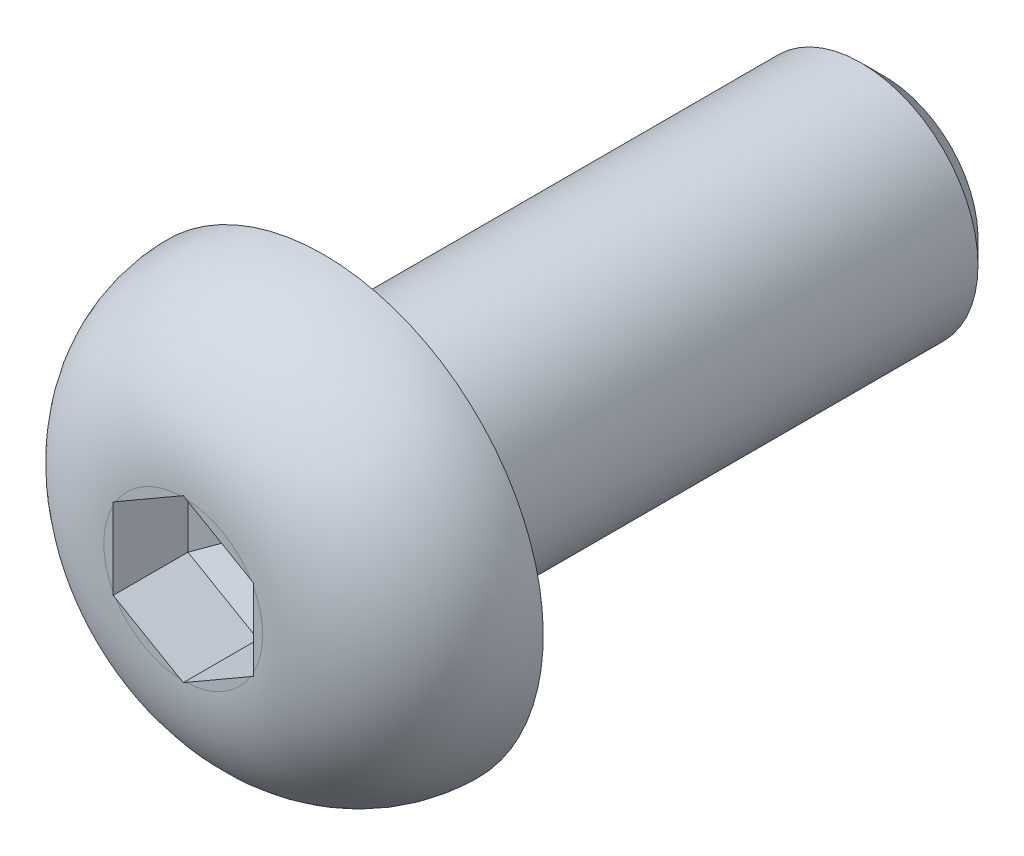
ISO-10303-21;
HEADER;
FILE_DESCRIPTION(('STEP AP214'),'2;1');
FILE_NAME('part.step','',(''),(''),'','','');
FILE_SCHEMA(('AUTOMOTIVE_DESIGN { 1 0 10303 214 1 1 1 1 }'));
ENDSEC;
DATA;
#1=APPLICATION_CONTEXT('core data for automotive mechanical design processes');
#2=APPLICATION_PROTOCOL_DEFINITION('international standard','automotive_design',2000,#1);
#3=PRODUCT_CONTEXT('',#1,'mechanical');
#4=PRODUCT('Part','Part','',(#3));
#5=PRODUCT_RELATED_PRODUCT_CATEGORY('part','',(#4));
#6=PRODUCT_DEFINITION_FORMATION('','',#4);
#7=PRODUCT_DEFINITION_CONTEXT('part definition',#1,'design');
#8=PRODUCT_DEFINITION('design','',#6,#7);
#9=PRODUCT_DEFINITION_SHAPE('','',#8);
#10=(LENGTH_UNIT() NAMED_UNIT(*) SI_UNIT(.MILLI.,.METRE.));
#11=(NAMED_UNIT(*) PLANE_ANGLE_UNIT() SI_UNIT($,.RADIAN.));
#12=(NAMED_UNIT(*) SI_UNIT($,.STERADIAN.) SOLID_ANGLE_UNIT());
#13=UNCERTAINTY_MEASURE_WITH_UNIT(LENGTH_MEASURE(1.E-05),#10,'distance_accuracy_value','');
#14=(GEOMETRIC_REPRESENTATION_CONTEXT(3) GLOBAL_UNCERTAINTY_ASSIGNED_CONTEXT((#13)) GLOBAL_UNIT_ASSIGNED_CONTEXT((#10,
#11,#12)) REPRESENTATION_CONTEXT('',''));
#15=CARTESIAN_POINT('',(0.,0.,0.));
#16=DIRECTION('',(0.,0.,1.));
#17=DIRECTION('',(1.,0.,0.));
#18=AXIS2_PLACEMENT_3D('',#15,#16,#17);
#19=CARTESIAN_POINT('',(0.,0.,7.5));
#20=DIRECTION('',(0.,0.,-1.));
#21=DIRECTION('',(0.,-1.,0.));
#22=AXIS2_PLACEMENT_3D('',#19,#20,#21);
#23=PLANE('',#22);
#24=CARTESIAN_POINT('',(0.,0.,7.499999999987));
#25=DIRECTION('',(0.,0.,-1.));
#26=DIRECTION('',(0.848717837075013,-0.528845944515708,0.));
#27=AXIS2_PLACEMENT_3D('',#24,#25,#26);
#28=CIRCLE('',#27,0.8499937568999);
#29=CARTESIAN_POINT('',(0.7214095809729,-0.4495192983039,7.5));
#30=VERTEX_POINT('',#29);
#31=CARTESIAN_POINT('',(0.02859309510343,-0.8495197335029,7.5));
#32=VERTEX_POINT('',#31);
#33=EDGE_CURVE('E224',#30,#32,#28,.T.);
#34=ORIENTED_EDGE('',*,*,#33,.F.);
#35=DIRECTION('',(0.86602396910502,0.500002484929412,6.10625033893714E-13));
#36=VECTOR('',#35,1.);
#37=CARTESIAN_POINT('',(0.02859309510343,-0.8495197335029,7.5));
#38=LINE('',#37,#36);
#39=EDGE_CURVE('E340',#32,#30,#38,.T.);
#40=ORIENTED_EDGE('',*,*,#39,.F.);
#41=EDGE_LOOP('',(#34,#40));
#42=FACE_BOUND('',#41,.T.);
#43=ADVANCED_FACE('F17',(#42),#23,.F.);
#44=CARTESIAN_POINT('',(0.,0.,7.5));
#45=DIRECTION('',(0.,0.,-1.));
#46=DIRECTION('',(0.,-1.,0.));
#47=AXIS2_PLACEMENT_3D('',#44,#45,#46);
#48=PLANE('',#47);
#49=CARTESIAN_POINT('',(0.,0.,7.499999999987));
#50=DIRECTION('',(0.,0.,-1.));
#51=DIRECTION('',(-0.0336351041015099,-0.999434179809797,0.));
#52=AXIS2_PLACEMENT_3D('',#49,#50,#51);
#53=CIRCLE('',#52,0.8499937568997);
#54=CARTESIAN_POINT('',(-0.02859309510341,-0.849519733503,7.499999999999));
#55=VERTEX_POINT('',#54);
#56=CARTESIAN_POINT('',(-0.7214095809727,-0.4495192983038,7.5));
#57=VERTEX_POINT('',#56);
#58=EDGE_CURVE('E210',#55,#57,#53,.T.);
#59=ORIENTED_EDGE('',*,*,#58,.F.);
#60=DIRECTION('',(0.866023969104909,-0.500002484929605,-6.31719353246506E-13));
#61=VECTOR('',#60,1.);
#62=CARTESIAN_POINT('',(-0.7214095809727,-0.4495192983038,7.5));
#63=LINE('',#62,#61);
#64=EDGE_CURVE('E316',#57,#55,#63,.T.);
#65=ORIENTED_EDGE('',*,*,#64,.F.);
#66=EDGE_LOOP('',(#59,#65));
#67=FACE_BOUND('',#66,.T.);
#68=ADVANCED_FACE('F406',(#67),#48,.F.);
#69=CARTESIAN_POINT('',(0.,0.,7.5));
#70=DIRECTION('',(0.,0.,-1.));
#71=DIRECTION('',(0.,-1.,0.));
#72=AXIS2_PLACEMENT_3D('',#69,#70,#71);
#73=PLANE('',#72);
#74=CARTESIAN_POINT('',(0.,0.,7.499999999987));
#75=DIRECTION('',(0.,0.,-1.));
#76=DIRECTION('',(-0.848717837075013,0.528845944515708,0.));
#77=AXIS2_PLACEMENT_3D('',#74,#75,#76);
#78=CIRCLE('',#77,0.8499937568999);
#79=CARTESIAN_POINT('',(-0.721409580973,0.4495192983038,7.5));
#80=VERTEX_POINT('',#79);
#81=CARTESIAN_POINT('',(-0.02859309510337,0.8495197335029,7.5));
#82=VERTEX_POINT('',#81);
#83=EDGE_CURVE('E208',#80,#82,#78,.T.);
#84=ORIENTED_EDGE('',*,*,#83,.F.);
#85=DIRECTION('',(-0.86602396910502,-0.500002484929412,6.10625033893614E-13));
#86=VECTOR('',#85,1.);
#87=CARTESIAN_POINT('',(-0.02859309510337,0.8495197335029,7.5));
#88=LINE('',#87,#86);
#89=EDGE_CURVE('E197',#82,#80,#88,.T.);
#90=ORIENTED_EDGE('',*,*,#89,.F.);
#91=EDGE_LOOP('',(#84,#90));
#92=FACE_BOUND('',#91,.T.);
#93=ADVANCED_FACE('F421',(#92),#73,.F.);
#94=CARTESIAN_POINT('',(0.,0.,7.5));
#95=DIRECTION('',(0.,0.,-1.));
#96=DIRECTION('',(0.,-1.,0.));
#97=AXIS2_PLACEMENT_3D('',#94,#95,#96);
#98=PLANE('',#97);
#99=CARTESIAN_POINT('',(0.,0.,7.499999999995));
#100=DIRECTION('',(0.,0.,-1.));
#101=DIRECTION('',(0.882352941176484,0.470588235294092,0.));
#102=AXIS2_PLACEMENT_3D('',#99,#100,#101);
#103=CIRCLE('',#102,0.8500038733679);
#104=CARTESIAN_POINT('',(0.74999840261235,0.400005026801156,7.49999999999049));
#105=VERTEX_POINT('',#104);
#106=CARTESIAN_POINT('',(0.749998738069626,-0.400003325957899,7.49999999999138));
#107=VERTEX_POINT('',#106);
#108=EDGE_CURVE('E360',#105,#107,#103,.T.);
#109=ORIENTED_EDGE('',*,*,#108,.F.);
#110=DIRECTION('',(0.,-1.,0.));
#111=VECTOR('',#110,1.);
#112=CARTESIAN_POINT('',(0.7499968052247,0.39999806325,7.499999999986));
#113=LINE('',#112,#111);
#114=EDGE_CURVE('E93',#105,#107,#113,.T.);
#115=ORIENTED_EDGE('',*,*,#114,.T.);
#116=EDGE_LOOP('',(#109,#115));
#117=FACE_BOUND('',#116,.T.);
#118=ADVANCED_FACE('F413',(#117),#98,.F.);
#119=CARTESIAN_POINT('',(0.,0.,7.5));
#120=DIRECTION('',(0.,0.,-1.));
#121=DIRECTION('',(0.,-1.,0.));
#122=AXIS2_PLACEMENT_3D('',#119,#120,#121);
#123=PLANE('',#122);
#124=CARTESIAN_POINT('',(0.,0.,7.499999999995));
#125=DIRECTION('',(0.,0.,-1.));
#126=DIRECTION('',(-0.882352941176484,-0.470588235294092,0.));
#127=AXIS2_PLACEMENT_3D('',#124,#125,#126);
#128=CIRCLE('',#127,0.8500038733679);
#129=CARTESIAN_POINT('',(-0.74999840261235,-0.400005026801156,7.49999999999049));
#130=VERTEX_POINT('',#129);
#131=CARTESIAN_POINT('',(-0.749998738069626,0.400003325957899,7.49999999999138));
#132=VERTEX_POINT('',#131);
#133=EDGE_CURVE('E385',#130,#132,#128,.T.);
#134=ORIENTED_EDGE('',*,*,#133,.F.);
#135=DIRECTION('',(0.,1.,0.));
#136=VECTOR('',#135,1.);
#137=CARTESIAN_POINT('',(-0.7499968052247,-0.39999806325,7.499999999986));
#138=LINE('',#137,#136);
#139=EDGE_CURVE('E11',#130,#132,#138,.T.);
#140=ORIENTED_EDGE('',*,*,#139,.T.);
#141=EDGE_LOOP('',(#134,#140));
#142=FACE_BOUND('',#141,.T.);
#143=ADVANCED_FACE('F411',(#142),#123,.F.);
#144=CARTESIAN_POINT('',(-0.75,0.4330127018922,7.5));
#145=DIRECTION('',(-1.,0.,0.));
#146=DIRECTION('',(0.,0.,1.));
#147=AXIS2_PLACEMENT_3D('',#144,#145,#146);
#148=PLANE('',#147);
#149=DIRECTION('',(2.24992903633302E-06,-5.67352059675705E-07,0.999999999997308));
#150=VECTOR('',#149,1.);
#151=CARTESIAN_POINT('',(-0.75,0.4330127018922,6.7));
#152=LINE('',#151,#150);
#153=CARTESIAN_POINT('',(-0.75,0.4330127018922,6.7));
#154=VERTEX_POINT('',#153);
#155=CARTESIAN_POINT('',(-0.749998523448235,0.43301280791993,7.49991440612962));
#156=VERTEX_POINT('',#155);
#157=EDGE_CURVE('E480',#154,#156,#152,.T.);
#158=ORIENTED_EDGE('',*,*,#157,.T.);
#159=CARTESIAN_POINT('',(-0.75,0.433012247970175,7.49991439546112));
#160=CARTESIAN_POINT('',(-0.75,0.42750992025355,7.49994336110495));
#161=CARTESIAN_POINT('',(-0.75,0.422007573480964,7.49996497763848));
#162=CARTESIAN_POINT('',(-0.75,0.411002842395928,7.49999351248346));
#163=CARTESIAN_POINT('',(-0.75,0.405500458083482,7.50000043079644));
#164=CARTESIAN_POINT('',(-0.75,0.39999805471508,7.50000000000065));
#165=B_SPLINE_CURVE_WITH_KNOTS('',3,(#159,#160,#161,#162,#163,#164),.UNSPECIFIED.,.F.,.F.,(4,2,
4),(0.,0.0165071677014205,0.0330143336866557),.UNSPECIFIED.);
#166=EDGE_CURVE('E303',#156,#132,#165,.T.);
#167=ORIENTED_EDGE('',*,*,#166,.T.);
#168=ORIENTED_EDGE('',*,*,#139,.F.);
#169=CARTESIAN_POINT('',(-0.75,-0.4000018227614,7.50000000000199));
#170=CARTESIAN_POINT('',(-0.75,-0.405503598118224,7.50000042758911));
#171=CARTESIAN_POINT('',(-0.75,-0.411005354421076,7.49999350767165));
#172=CARTESIAN_POINT('',(-0.75,-0.422008829490639,7.49996497282612));
#173=CARTESIAN_POINT('',(-0.75,-0.427510548257345,7.49994335789651));
#174=CARTESIAN_POINT('',(-0.75,-0.433012247970075,7.4999143954608));
#175=B_SPLINE_CURVE_WITH_KNOTS('',3,(#169,#170,#171,#172,#173,#174),.UNSPECIFIED.,.F.,.F.,(4,2,
4),(0.,0.0165052819639968,0.0330105656434137),.UNSPECIFIED.);
#176=CARTESIAN_POINT('',(-0.749999423323558,-0.433012807875431,7.49991439780553));
#177=VERTEX_POINT('',#176);
#178=EDGE_CURVE('E286',#130,#177,#175,.T.);
#179=ORIENTED_EDGE('',*,*,#178,.T.);
#180=DIRECTION('',(2.24992919913702E-06,5.67352198329605E-07,0.999999999997308));
#181=VECTOR('',#180,1.);
#182=CARTESIAN_POINT('',(-0.75,-0.4330127018922,6.7));
#183=LINE('',#182,#181);
#184=CARTESIAN_POINT('',(-0.75,-0.4330127018922,6.7));
#185=VERTEX_POINT('',#184);
#186=EDGE_CURVE('E330',#185,#177,#183,.T.);
#187=ORIENTED_EDGE('',*,*,#186,.F.);
#188=DIRECTION('',(0.,1.,0.));
#189=VECTOR('',#188,1.);
#190=CARTESIAN_POINT('',(-0.75,-0.4330127018922,6.7));
#191=LINE('',#190,#189);
#192=EDGE_CURVE('E34',#185,#154,#191,.T.);
#193=ORIENTED_EDGE('',*,*,#192,.T.);
#194=EDGE_LOOP('',(#158,#167,#168,#179,#187,#193));
#195=FACE_BOUND('',#194,.T.);
#196=ADVANCED_FACE('F409',(#195),#148,.F.);
#197=CARTESIAN_POINT('',(-0.3966506350946,0.,6.5));
#198=DIRECTION('',(-0.492581293369386,0.,-0.870266435881876));
#199=DIRECTION('',(-0.870266435881876,0.,0.492581293369386));
#200=AXIS2_PLACEMENT_3D('',#197,#198,#199);
#201=PLANE('',#200);
#202=DIRECTION('',(0.777626846502185,0.448963069157091,-0.440146169053091));
#203=VECTOR('',#202,1.);
#204=CARTESIAN_POINT('',(-0.75,-0.4330127018922,6.7));
#205=LINE('',#204,#203);
#206=CARTESIAN_POINT('',(-0.04330127018922,-0.025,6.3));
#207=VERTEX_POINT('',#206);
#208=EDGE_CURVE('E472',#185,#207,#205,.T.);
#209=ORIENTED_EDGE('',*,*,#208,.T.);
#210=DIRECTION('',(0.,1.,0.));
#211=VECTOR('',#210,1.);
#212=CARTESIAN_POINT('',(-0.04330127018922,-0.025,6.3));
#213=LINE('',#212,#211);
#214=CARTESIAN_POINT('',(-0.04330127018922,0.025,6.3));
#215=VERTEX_POINT('',#214);
#216=EDGE_CURVE('E159',#207,#215,#213,.T.);
#217=ORIENTED_EDGE('',*,*,#216,.T.);
#218=DIRECTION('',(0.777626846502185,-0.448963069157091,-0.440146169053091));
#219=VECTOR('',#218,1.);
#220=CARTESIAN_POINT('',(-0.75,0.4330127018922,6.7));
#221=LINE('',#220,#219);
#222=EDGE_CURVE('E479',#154,#215,#221,.T.);
#223=ORIENTED_EDGE('',*,*,#222,.F.);
#224=ORIENTED_EDGE('',*,*,#192,.F.);
#225=EDGE_LOOP('',(#209,#217,#223,#224));
#226=FACE_BOUND('',#225,.T.);
#227=ADVANCED_FACE('F420',(#226),#201,.F.);
#228=CARTESIAN_POINT('',(0.,0.,6.3));
#229=DIRECTION('',(0.,0.,1.));
#230=DIRECTION('',(1.,0.,0.));
#231=AXIS2_PLACEMENT_3D('',#228,#229,#230);
#232=PLANE('',#231);
#233=DIRECTION('',(0.,-1.,0.));
#234=VECTOR('',#233,1.);
#235=CARTESIAN_POINT('',(0.04330127018922,0.025,6.3));
#236=LINE('',#235,#234);
#237=CARTESIAN_POINT('',(0.04330127018922,0.025,6.3));
#238=VERTEX_POINT('',#237);
#239=CARTESIAN_POINT('',(0.04330127018922,-0.025,6.3));
#240=VERTEX_POINT('',#239);
#241=EDGE_CURVE('E441',#238,#240,#236,.T.);
#242=ORIENTED_EDGE('',*,*,#241,.F.);
#243=DIRECTION('',(0.866025403784429,-0.500000000000017,1.06581410364004E-13));
#244=VECTOR('',#243,1.);
#245=CARTESIAN_POINT('',(0.,0.05,6.3));
#246=LINE('',#245,#244);
#247=CARTESIAN_POINT('',(0.,0.05,6.3));
#248=VERTEX_POINT('',#247);
#249=EDGE_CURVE('E169',#248,#238,#246,.T.);
#250=ORIENTED_EDGE('',*,*,#249,.F.);
#251=DIRECTION('',(0.866025403784429,0.500000000000017,-1.06581410364004E-13));
#252=VECTOR('',#251,1.);
#253=CARTESIAN_POINT('',(-0.04330127018922,0.025,6.3));
#254=LINE('',#253,#252);
#255=EDGE_CURVE('E484',#215,#248,#254,.T.);
#256=ORIENTED_EDGE('',*,*,#255,.F.);
#257=ORIENTED_EDGE('',*,*,#216,.F.);
#258=DIRECTION('',(-0.866025403784429,0.500000000000017,1.06581410364004E-13));
#259=VECTOR('',#258,1.);
#260=CARTESIAN_POINT('',(0.,-0.05,6.3));
#261=LINE('',#260,#259);
#262=CARTESIAN_POINT('',(0.,-0.05,6.3));
#263=VERTEX_POINT('',#262);
#264=EDGE_CURVE('E455',#263,#207,#261,.T.);
#265=ORIENTED_EDGE('',*,*,#264,.F.);
#266=DIRECTION('',(-0.866025403784429,-0.500000000000017,-1.06581410364004E-13));
#267=VECTOR('',#266,1.);
#268=CARTESIAN_POINT('',(0.04330127018922,-0.025,6.3));
#269=LINE('',#268,#267);
#270=EDGE_CURVE('E452',#240,#263,#269,.T.);
#271=ORIENTED_EDGE('',*,*,#270,.F.);
#272=EDGE_LOOP('',(#242,#250,#256,#257,#265,#271));
#273=FACE_BOUND('',#272,.T.);
#274=ADVANCED_FACE('F453',(#273),#232,.T.);
#275=CARTESIAN_POINT('',(0.3966506350946,0.,6.5));
#276=DIRECTION('',(0.492581293369386,0.,-0.870266435881876));
#277=DIRECTION('',(0.,-1.,0.));
#278=AXIS2_PLACEMENT_3D('',#275,#276,#277);
#279=PLANE('',#278);
#280=DIRECTION('',(-0.777626846502185,-0.448963069157091,-0.440146169053091));
#281=VECTOR('',#280,1.);
#282=CARTESIAN_POINT('',(0.75,0.4330127018922,6.7));
#283=LINE('',#282,#281);
#284=CARTESIAN_POINT('',(0.75,0.4330127018922,6.7));
#285=VERTEX_POINT('',#284);
#286=EDGE_CURVE('E448',#285,#238,#283,.T.);
#287=ORIENTED_EDGE('',*,*,#286,.T.);
#288=ORIENTED_EDGE('',*,*,#241,.T.);
#289=DIRECTION('',(-0.777626846502185,0.448963069157091,-0.440146169053091));
#290=VECTOR('',#289,1.);
#291=CARTESIAN_POINT('',(0.75,-0.4330127018922,6.7));
#292=LINE('',#291,#290);
#293=CARTESIAN_POINT('',(0.75,-0.4330127018922,6.7));
#294=VERTEX_POINT('',#293);
#295=EDGE_CURVE('E445',#294,#240,#292,.T.);
#296=ORIENTED_EDGE('',*,*,#295,.F.);
#297=DIRECTION('',(0.,-1.,0.));
#298=VECTOR('',#297,1.);
#299=CARTESIAN_POINT('',(0.75,0.4330127018922,6.7));
#300=LINE('',#299,#298);
#301=EDGE_CURVE('E48',#285,#294,#300,.T.);
#302=ORIENTED_EDGE('',*,*,#301,.F.);
#303=EDGE_LOOP('',(#287,#288,#296,#302));
#304=FACE_BOUND('',#303,.T.);
#305=ADVANCED_FACE('F443',(#304),#279,.F.);
#306=CARTESIAN_POINT('',(0.75,-0.4330127018922,7.5));
#307=DIRECTION('',(1.,0.,0.));
#308=DIRECTION('',(0.,1.,0.));
#309=AXIS2_PLACEMENT_3D('',#306,#307,#308);
#310=PLANE('',#309);
#311=DIRECTION('',(-2.24992903647101E-06,5.67352059606305E-07,0.999999999997308));
#312=VECTOR('',#311,1.);
#313=CARTESIAN_POINT('',(0.75,-0.4330127018922,6.7));
#314=LINE('',#313,#312);
#315=CARTESIAN_POINT('',(0.749998523448235,-0.433012807919931,7.49991440612962));
#316=VERTEX_POINT('',#315);
#317=EDGE_CURVE('E346',#294,#316,#314,.T.);
#318=ORIENTED_EDGE('',*,*,#317,.T.);
#319=CARTESIAN_POINT('',(0.75,-0.433012247970175,7.49991439546112));
#320=CARTESIAN_POINT('',(0.75,-0.42750992025355,7.49994336110495));
#321=CARTESIAN_POINT('',(0.75,-0.422007573480964,7.49996497763848));
#322=CARTESIAN_POINT('',(0.75,-0.411002842395928,7.49999351248346));
#323=CARTESIAN_POINT('',(0.75,-0.405500458083482,7.50000043079644));
#324=CARTESIAN_POINT('',(0.75,-0.39999805471508,7.50000000000065));
#325=B_SPLINE_CURVE_WITH_KNOTS('',3,(#319,#320,#321,#322,#323,#324),.UNSPECIFIED.,.F.,.F.,(4,2,
4),(0.,0.0165071677014205,0.0330143336866557),.UNSPECIFIED.);
#326=EDGE_CURVE('E364',#316,#107,#325,.T.);
#327=ORIENTED_EDGE('',*,*,#326,.T.);
#328=ORIENTED_EDGE('',*,*,#114,.F.);
#329=CARTESIAN_POINT('',(0.75,0.4000018227614,7.50000000000199));
#330=CARTESIAN_POINT('',(0.75,0.405503598118224,7.50000042758911));
#331=CARTESIAN_POINT('',(0.75,0.411005354421076,7.49999350767165));
#332=CARTESIAN_POINT('',(0.75,0.422008829490639,7.49996497282612));
#333=CARTESIAN_POINT('',(0.75,0.427510548257345,7.49994335789651));
#334=CARTESIAN_POINT('',(0.75,0.433012247970075,7.4999143954608));
#335=B_SPLINE_CURVE_WITH_KNOTS('',3,(#329,#330,#331,#332,#333,#334),.UNSPECIFIED.,.F.,.F.,(4,2,
4),(0.,0.0165052819639968,0.0330105656434137),.UNSPECIFIED.);
#336=CARTESIAN_POINT('',(0.749999100124604,0.433012248014533,7.4999144037849));
#337=VERTEX_POINT('',#336);
#338=EDGE_CURVE('E365',#105,#337,#335,.T.);
#339=ORIENTED_EDGE('',*,*,#338,.T.);
#340=DIRECTION('',(-2.24992919913702E-06,-5.67352198329605E-07,0.999999999997308));
#341=VECTOR('',#340,1.);
#342=CARTESIAN_POINT('',(0.75,0.4330127018922,6.7));
#343=LINE('',#342,#341);
#344=EDGE_CURVE('E102',#285,#337,#343,.T.);
#345=ORIENTED_EDGE('',*,*,#344,.F.);
#346=ORIENTED_EDGE('',*,*,#301,.T.);
#347=EDGE_LOOP('',(#318,#327,#328,#339,#345,#346));
#348=FACE_BOUND('',#347,.T.);
#349=ADVANCED_FACE('F616',(#348),#310,.F.);
#350=CARTESIAN_POINT('',(0.,0.,7.5));
#351=DIRECTION('',(0.,0.,-1.));
#352=DIRECTION('',(0.,-1.,0.));
#353=AXIS2_PLACEMENT_3D('',#350,#351,#352);
#354=PLANE('',#353);
#355=CARTESIAN_POINT('',(0.,0.,7.499999999987));
#356=DIRECTION('',(0.,0.,-1.));
#357=DIRECTION('',(0.0336351041015299,0.999434179809796,0.));
#358=AXIS2_PLACEMENT_3D('',#355,#356,#357);
#359=CIRCLE('',#358,0.8499937568997);
#360=CARTESIAN_POINT('',(0.028589628499,0.8495128132705,7.499999999987));
#361=VERTEX_POINT('',#360);
#362=CARTESIAN_POINT('',(0.7214095809727,0.4495192983038,7.5));
#363=VERTEX_POINT('',#362);
#364=EDGE_CURVE('E214',#361,#363,#359,.T.);
#365=ORIENTED_EDGE('',*,*,#364,.F.);
#366=DIRECTION('',(-0.866023969104909,0.500002484929605,-6.31719353246706E-13));
#367=VECTOR('',#366,1.);
#368=CARTESIAN_POINT('',(0.7214095809727,0.4495192983038,7.5));
#369=LINE('',#368,#367);
#370=EDGE_CURVE('E111',#363,#361,#369,.T.);
#371=ORIENTED_EDGE('',*,*,#370,.F.);
#372=EDGE_LOOP('',(#365,#371));
#373=FACE_BOUND('',#372,.T.);
#374=ADVANCED_FACE('F244',(#373),#354,.F.);
#375=CARTESIAN_POINT('',(0.75,0.4330127018922,7.5));
#376=DIRECTION('',(0.500000000000017,0.866025403784429,0.));
#377=DIRECTION('',(0.,0.,-1.));
#378=AXIS2_PLACEMENT_3D('',#375,#376,#377);
#379=PLANE('',#378);
#380=ORIENTED_EDGE('',*,*,#344,.T.);
#381=CARTESIAN_POINT('',(0.749998846647121,0.433013367780795,7.49991440015043));
#382=CARTESIAN_POINT('',(0.745234008263265,0.435764348504359,7.49994336307334));
#383=CARTESIAN_POINT('',(0.740469153378446,0.43851533875476,7.49996497785566));
#384=CARTESIAN_POINT('',(0.730939411102167,0.444017338023277,7.49999351113762));
#385=CARTESIAN_POINT('',(0.72617452371071,0.446768347041393,7.5000004296388));
#386=CARTESIAN_POINT('',(0.721409619818294,0.449519365586343,7.50000000000091));
#387=B_SPLINE_CURVE_WITH_KNOTS('',3,(#381,#382,#383,#384,#385,#386),.UNSPECIFIED.,.F.,.F.,(4,2,
4),(0.,0.0165060688739016,0.0330121360320727),.UNSPECIFIED.);
#388=EDGE_CURVE('E221',#337,#363,#387,.T.);
#389=ORIENTED_EDGE('',*,*,#388,.T.);
#390=ORIENTED_EDGE('',*,*,#370,.T.);
#391=CARTESIAN_POINT('',(0.0285923828079302,0.849517583873507,7.5000000000003));
#392=CARTESIAN_POINT('',(0.02382676206383,0.852269016292969,7.50000043171068));
#393=CARTESIAN_POINT('',(0.0190611578259205,0.855020439182577,7.4999935130643));
#394=CARTESIAN_POINT('',(0.00952998186689764,0.860523266188213,7.49996497505652));
#395=CARTESIAN_POINT('',(0.00476441014578776,0.863274670304238,7.49994335569359));
#396=CARTESIAN_POINT('',(-1.14506912798834E-06,0.866026064890408,7.49991438597236));
#397=B_SPLINE_CURVE_WITH_KNOTS('',3,(#391,#392,#393,#394,#395,#396),.UNSPECIFIED.,.F.,.F.,(4,2,
4),(0.,0.016508550385712,0.0330171024881889),.UNSPECIFIED.);
#398=CARTESIAN_POINT('',(-6.913715993579E-11,0.8660280478621,7.49991436478));
#399=VERTEX_POINT('',#398);
#400=EDGE_CURVE('E205',#361,#399,#397,.T.);
#401=ORIENTED_EDGE('',*,*,#400,.T.);
#402=DIRECTION('',(-8.64359124378132E-11,3.30545092836713E-06,0.999999999994537));
#403=VECTOR('',#402,1.);
#404=CARTESIAN_POINT('',(0.,0.8660254037844,6.7));
#405=LINE('',#404,#403);
#406=CARTESIAN_POINT('',(0.,0.8660254037844,6.7));
#407=VERTEX_POINT('',#406);
#408=EDGE_CURVE('E186',#407,#399,#405,.T.);
#409=ORIENTED_EDGE('',*,*,#408,.F.);
#410=DIRECTION('',(0.866025403784429,-0.500000000000017,0.));
#411=VECTOR('',#410,1.);
#412=CARTESIAN_POINT('',(0.,0.8660254037844,6.7));
#413=LINE('',#412,#411);
#414=EDGE_CURVE('E368',#407,#285,#413,.T.);
#415=ORIENTED_EDGE('',*,*,#414,.T.);
#416=EDGE_LOOP('',(#380,#389,#390,#401,#409,#415));
#417=FACE_BOUND('',#416,.T.);
#418=ADVANCED_FACE('F212',(#417),#379,.F.);
#419=CARTESIAN_POINT('',(0.1983253175473,0.3435095264192,6.5));
#420=DIRECTION('',(0.246290646684714,0.426587913486924,-0.87026643588185));
#421=DIRECTION('',(-0.962209283245216,0.,-0.272311026652846));
#422=AXIS2_PLACEMENT_3D('',#419,#420,#421);
#423=PLANE('',#422);
#424=DIRECTION('',(0.,-0.897926138314213,-0.440146169053106));
#425=VECTOR('',#424,1.);
#426=CARTESIAN_POINT('',(0.,0.8660254037844,6.7));
#427=LINE('',#426,#425);
#428=EDGE_CURVE('E487',#407,#248,#427,.T.);
#429=ORIENTED_EDGE('',*,*,#428,.T.);
#430=ORIENTED_EDGE('',*,*,#249,.T.);
#431=ORIENTED_EDGE('',*,*,#286,.F.);
#432=ORIENTED_EDGE('',*,*,#414,.F.);
#433=EDGE_LOOP('',(#429,#430,#431,#432));
#434=FACE_BOUND('',#433,.T.);
#435=ADVANCED_FACE('F243',(#434),#423,.F.);
#436=CARTESIAN_POINT('',(-0.1983253175473,0.3435095264192,6.5));
#437=DIRECTION('',(-0.246290646684714,0.426587913486924,-0.87026643588185));
#438=DIRECTION('',(-0.962209283245216,0.,0.272311026652846));
#439=AXIS2_PLACEMENT_3D('',#436,#437,#438);
#440=PLANE('',#439);
#441=ORIENTED_EDGE('',*,*,#222,.T.);
#442=ORIENTED_EDGE('',*,*,#255,.T.);
#443=ORIENTED_EDGE('',*,*,#428,.F.);
#444=DIRECTION('',(0.866025403784429,0.500000000000017,0.));
#445=VECTOR('',#444,1.);
#446=CARTESIAN_POINT('',(-0.75,0.4330127018922,6.7));
#447=LINE('',#446,#445);
#448=EDGE_CURVE('E194',#154,#407,#447,.T.);
#449=ORIENTED_EDGE('',*,*,#448,.F.);
#450=EDGE_LOOP('',(#441,#442,#443,#449));
#451=FACE_BOUND('',#450,.T.);
#452=ADVANCED_FACE('F550',(#451),#440,.F.);
#453=CARTESIAN_POINT('',(0.,0.8660254037844,7.5));
#454=DIRECTION('',(-0.500000000000017,0.866025403784429,0.));
#455=DIRECTION('',(0.,0.,1.));
#456=AXIS2_PLACEMENT_3D('',#453,#454,#455);
#457=PLANE('',#456);
#458=ORIENTED_EDGE('',*,*,#408,.T.);
#459=CARTESIAN_POINT('',(1.14496544194069E-06,0.866026064830506,7.49991438597353));
#460=CARTESIAN_POINT('',(-0.00476434413338689,0.863274708416477,7.49994335530435));
#461=CARTESIAN_POINT('',(-0.00952984973820052,0.860523342472713,7.499964974472));
#462=CARTESIAN_POINT('',(-0.0190608934642393,0.855020591811826,7.49999351247945));
#463=CARTESIAN_POINT('',(-0.0238264315854611,0.852269207094705,7.50000043132078));
#464=CARTESIAN_POINT('',(-0.0285919862126642,0.849517812847852,7.50000000000045));
#465=B_SPLINE_CURVE_WITH_KNOTS('',3,(#459,#460,#461,#462,#463,#464),.UNSPECIFIED.,.F.,.F.,(4,2,
4),(0.,0.0165083230683741,0.0330166444200775),.UNSPECIFIED.);
#466=EDGE_CURVE('E190',#399,#82,#465,.T.);
#467=ORIENTED_EDGE('',*,*,#466,.T.);
#468=ORIENTED_EDGE('',*,*,#89,.T.);
#469=CARTESIAN_POINT('',(-0.721409619818502,0.449519365586183,7.5000000000009));
#470=CARTESIAN_POINT('',(-0.726174523710887,0.446768347041252,7.50000042963881));
#471=CARTESIAN_POINT('',(-0.730939411102311,0.444017338023155,7.49999351113764));
#472=CARTESIAN_POINT('',(-0.740469153378525,0.438515338754675,7.49996497785562));
#473=CARTESIAN_POINT('',(-0.745234008263313,0.435764348504293,7.49994336307324));
#474=CARTESIAN_POINT('',(-0.749998846647136,0.433013367780748,7.49991440015024));
#475=B_SPLINE_CURVE_WITH_KNOTS('',3,(#469,#470,#471,#472,#473,#474),.UNSPECIFIED.,.F.,.F.,(4,2,
4),(0.,0.0165060671580596,0.0330121360318501),.UNSPECIFIED.);
#476=EDGE_CURVE('E198',#80,#156,#475,.T.);
#477=ORIENTED_EDGE('',*,*,#476,.T.);
#478=ORIENTED_EDGE('',*,*,#157,.F.);
#479=ORIENTED_EDGE('',*,*,#448,.T.);
#480=EDGE_LOOP('',(#458,#467,#468,#477,#478,#479));
#481=FACE_BOUND('',#480,.T.);
#482=ADVANCED_FACE('F188',(#481),#457,.F.);
#483=CARTESIAN_POINT('',(-0.75,-0.4330127018922,7.5));
#484=DIRECTION('',(-0.500000000000017,-0.866025403784429,0.));
#485=DIRECTION('',(-0.866025403784429,0.500000000000017,0.));
#486=AXIS2_PLACEMENT_3D('',#483,#484,#485);
#487=PLANE('',#486);
#488=ORIENTED_EDGE('',*,*,#186,.T.);
#489=CARTESIAN_POINT('',(-0.749998846647121,-0.433013367780795,7.49991440015043));
#490=CARTESIAN_POINT('',(-0.745234008263265,-0.435764348504359,7.49994336307334));
#491=CARTESIAN_POINT('',(-0.740469153378446,-0.43851533875476,7.49996497785566));
#492=CARTESIAN_POINT('',(-0.730939411102167,-0.444017338023277,7.49999351113762));
#493=CARTESIAN_POINT('',(-0.72617452371071,-0.446768347041393,7.5000004296388));
#494=CARTESIAN_POINT('',(-0.721409619818294,-0.449519365586343,7.50000000000091));
#495=B_SPLINE_CURVE_WITH_KNOTS('',3,(#489,#490,#491,#492,#493,#494),.UNSPECIFIED.,.F.,.F.,(4,2,
4),(0.,0.0165060688739016,0.0330121360320727),.UNSPECIFIED.);
#496=EDGE_CURVE('E277',#177,#57,#495,.T.);
#497=ORIENTED_EDGE('',*,*,#496,.T.);
#498=ORIENTED_EDGE('',*,*,#64,.T.);
#499=CARTESIAN_POINT('',(-0.0285919862126651,-0.84951781284789,7.50000000000103));
#500=CARTESIAN_POINT('',(-0.0238252672641823,-0.852269879315948,7.50000043163591));
#501=CARTESIAN_POINT('',(-0.0190585648343779,-0.855021936246942,7.49999350936014));
#502=CARTESIAN_POINT('',(-0.00952519251607328,-0.860526031321201,7.4999649569858));
#503=CARTESIAN_POINT('',(-0.0047585226275765,-0.863278069464463,7.4999433268857));
#504=CARTESIAN_POINT('',(8.13074223842222E-06,-0.866030098070659,7.49991434287341));
#505=B_SPLINE_CURVE_WITH_KNOTS('',3,(#499,#500,#501,#502,#503,#504),.UNSPECIFIED.,.F.,.F.,(4,2,
4),(0.,0.0165123546447126,0.0330247110078094),.UNSPECIFIED.);
#506=CARTESIAN_POINT('',(7.787853057944E-06,-0.8660306919043,7.499914336526));
#507=VERTEX_POINT('',#506);
#508=EDGE_CURVE('E314',#55,#507,#505,.T.);
#509=ORIENTED_EDGE('',*,*,#508,.T.);
#510=DIRECTION('',(8.64359470954432E-11,-3.30545092836713E-06,0.999999999994537));
#511=VECTOR('',#510,1.);
#512=CARTESIAN_POINT('',(0.,-0.8660254037844,6.7));
#513=LINE('',#512,#511);
#514=CARTESIAN_POINT('',(0.,-0.8660254037844,6.7));
#515=VERTEX_POINT('',#514);
#516=EDGE_CURVE('E337',#515,#507,#513,.T.);
#517=ORIENTED_EDGE('',*,*,#516,.F.);
#518=DIRECTION('',(-0.866025403784429,0.500000000000017,0.));
#519=VECTOR('',#518,1.);
#520=CARTESIAN_POINT('',(0.,-0.8660254037844,6.7));
#521=LINE('',#520,#519);
#522=EDGE_CURVE('E399',#515,#185,#521,.T.);
#523=ORIENTED_EDGE('',*,*,#522,.T.);
#524=EDGE_LOOP('',(#488,#497,#498,#509,#517,#523));
#525=FACE_BOUND('',#524,.T.);
#526=ADVANCED_FACE('F254',(#525),#487,.F.);
#527=CARTESIAN_POINT('',(-0.1983253175473,-0.3435095264192,6.5));
#528=DIRECTION('',(-0.246290646684714,-0.426587913486924,-0.87026643588185));
#529=DIRECTION('',(0.,-0.897926138314242,0.440146169053045));
#530=AXIS2_PLACEMENT_3D('',#527,#528,#529);
#531=PLANE('',#530);
#532=DIRECTION('',(0.,0.897926138314213,-0.440146169053106));
#533=VECTOR('',#532,1.);
#534=CARTESIAN_POINT('',(0.,-0.8660254037844,6.7));
#535=LINE('',#534,#533);
#536=EDGE_CURVE('E459',#515,#263,#535,.T.);
#537=ORIENTED_EDGE('',*,*,#536,.T.);
#538=ORIENTED_EDGE('',*,*,#264,.T.);
#539=ORIENTED_EDGE('',*,*,#208,.F.);
#540=ORIENTED_EDGE('',*,*,#522,.F.);
#541=EDGE_LOOP('',(#537,#538,#539,#540));
#542=FACE_BOUND('',#541,.T.);
#543=ADVANCED_FACE('F252',(#542),#531,.F.);
#544=CARTESIAN_POINT('',(0.1983253175473,-0.3435095264192,6.5));
#545=DIRECTION('',(0.246290646684714,-0.426587913486924,-0.87026643588185));
#546=DIRECTION('',(0.,-0.897926138314242,0.440146169053045));
#547=AXIS2_PLACEMENT_3D('',#544,#545,#546);
#548=PLANE('',#547);
#549=ORIENTED_EDGE('',*,*,#295,.T.);
#550=ORIENTED_EDGE('',*,*,#270,.T.);
#551=ORIENTED_EDGE('',*,*,#536,.F.);
#552=DIRECTION('',(-0.866025403784429,-0.500000000000017,0.));
#553=VECTOR('',#552,1.);
#554=CARTESIAN_POINT('',(0.75,-0.4330127018922,6.7));
#555=LINE('',#554,#553);
#556=EDGE_CURVE('E357',#294,#515,#555,.T.);
#557=ORIENTED_EDGE('',*,*,#556,.F.);
#558=EDGE_LOOP('',(#549,#550,#551,#557));
#559=FACE_BOUND('',#558,.T.);
#560=ADVANCED_FACE('F247',(#559),#548,.F.);
#561=CARTESIAN_POINT('',(0.,-0.8660254037844,7.5));
#562=DIRECTION('',(0.500000000000017,-0.866025403784429,0.));
#563=DIRECTION('',(0.,0.,-1.));
#564=AXIS2_PLACEMENT_3D('',#561,#562,#563);
#565=PLANE('',#564);
#566=ORIENTED_EDGE('',*,*,#516,.T.);
#567=CARTESIAN_POINT('',(3.55070383271325E-06,-0.866023353784586,7.49991441493704));
#568=CARTESIAN_POINT('',(0.00476825720801815,-0.863272449201785,7.49994337440198));
#569=CARTESIAN_POINT('',(0.00953298020965801,-0.860521535094174,7.49996498622305));
#570=CARTESIAN_POINT('',(0.0190624587126203,-0.855019688115252,7.49999351457599));
#571=CARTESIAN_POINT('',(0.0238272142139392,-0.852268755243943,7.50000043110939));
#572=CARTESIAN_POINT('',(0.0285919862127092,-0.849517812847826,7.50000000000045));
#573=B_SPLINE_CURVE_WITH_KNOTS('',3,(#567,#568,#569,#570,#571,#572),.UNSPECIFIED.,.F.,.F.,(4,2,
4),(0.,0.0165056119857934,0.0330112222560653),.UNSPECIFIED.);
#574=EDGE_CURVE('E215',#507,#32,#573,.T.);
#575=ORIENTED_EDGE('',*,*,#574,.T.);
#576=ORIENTED_EDGE('',*,*,#39,.T.);
#577=CARTESIAN_POINT('',(0.721409619818384,-0.449519365586252,7.5000000000009));
#578=CARTESIAN_POINT('',(0.726174523710788,-0.446768347041309,7.50000042963881));
#579=CARTESIAN_POINT('',(0.730939411102232,-0.444017338023201,7.49999351113764));
#580=CARTESIAN_POINT('',(0.740469153378486,-0.438515338754697,7.49996497785562));
#581=CARTESIAN_POINT('',(0.745234008263293,-0.435764348504305,7.49994336307324));
#582=CARTESIAN_POINT('',(0.749998846647136,-0.433013367780748,7.49991440015024));
#583=B_SPLINE_CURVE_WITH_KNOTS('',3,(#577,#578,#579,#580,#581,#582),.UNSPECIFIED.,.F.,.F.,(4,2,
4),(0.,0.0165060671581279,0.0330121360319867),.UNSPECIFIED.);
#584=EDGE_CURVE('E278',#30,#316,#583,.T.);
#585=ORIENTED_EDGE('',*,*,#584,.T.);
#586=ORIENTED_EDGE('',*,*,#317,.F.);
#587=ORIENTED_EDGE('',*,*,#556,.T.);
#588=EDGE_LOOP('',(#566,#575,#576,#585,#586,#587));
#589=FACE_BOUND('',#588,.T.);
#590=ADVANCED_FACE('F251',(#589),#565,.F.);
#591=CARTESIAN_POINT('',(0.,0.,5.99999999999932));
#592=DIRECTION('',(0.,0.,-1.));
#593=DIRECTION('',(0.,1.,0.));
#594=AXIS2_PLACEMENT_3D('',#591,#592,#593);
#595=DEGENERATE_TOROIDAL_SURFACE('',#594,0.849999999998394,1.5000000000016,.T.);
#596=ORIENTED_EDGE('',*,*,#574,.F.);
#597=ORIENTED_EDGE('',*,*,#508,.F.);
#598=ORIENTED_EDGE('',*,*,#58,.T.);
#599=ORIENTED_EDGE('',*,*,#496,.F.);
#600=ORIENTED_EDGE('',*,*,#178,.F.);
#601=ORIENTED_EDGE('',*,*,#133,.T.);
#602=ORIENTED_EDGE('',*,*,#166,.F.);
#603=ORIENTED_EDGE('',*,*,#476,.F.);
#604=ORIENTED_EDGE('',*,*,#83,.T.);
#605=ORIENTED_EDGE('',*,*,#466,.F.);
#606=ORIENTED_EDGE('',*,*,#400,.F.);
#607=ORIENTED_EDGE('',*,*,#364,.T.);
#608=ORIENTED_EDGE('',*,*,#388,.F.);
#609=ORIENTED_EDGE('',*,*,#338,.F.);
#610=ORIENTED_EDGE('',*,*,#108,.T.);
#611=ORIENTED_EDGE('',*,*,#326,.F.);
#612=ORIENTED_EDGE('',*,*,#584,.F.);
#613=ORIENTED_EDGE('',*,*,#33,.T.);
#614=EDGE_LOOP('',(#596,#597,#598,#599,#600,#601,#602,#603,#604,#605,#606,#607,#608,#609,#610,
#611,#612,#613));
#615=FACE_BOUND('',#614,.T.);
#616=CARTESIAN_POINT('',(0.,1.03263435393E-13,6.));
#617=DIRECTION('',(0.,0.,1.));
#618=DIRECTION('',(0.,1.,0.));
#619=AXIS2_PLACEMENT_3D('',#616,#617,#618);
#620=CIRCLE('',#619,2.35);
#621=CARTESIAN_POINT('',(0.,2.3500000000001,6.00000000000015));
#622=VERTEX_POINT('',#621);
#623=EDGE_CURVE('E352',#622,#622,#620,.T.);
#624=ORIENTED_EDGE('',*,*,#623,.T.);
#625=EDGE_LOOP('',(#624));
#626=FACE_BOUND('',#625,.T.);
#627=ADVANCED_FACE('F19',(#615,#626),#595,.T.);
#628=CARTESIAN_POINT('',(0.,0.,6.));
#629=DIRECTION('',(0.,0.,-1.));
#630=DIRECTION('',(0.,-1.,0.));
#631=AXIS2_PLACEMENT_3D('',#628,#629,#630);
#632=PLANE('',#631);
#633=CARTESIAN_POINT('',(0.,0.,6.));
#634=DIRECTION('',(0.,0.,-1.));
#635=DIRECTION('',(1.,0.,0.));
#636=AXIS2_PLACEMENT_3D('',#633,#634,#635);
#637=CIRCLE('',#636,1.25);
#638=CARTESIAN_POINT('',(1.25,0.,6.));
#639=VERTEX_POINT('',#638);
#640=EDGE_CURVE('E377',#639,#639,#637,.T.);
#641=ORIENTED_EDGE('',*,*,#640,.F.);
#642=EDGE_LOOP('',(#641));
#643=FACE_BOUND('',#642,.T.);
#644=ORIENTED_EDGE('',*,*,#623,.F.);
#645=EDGE_LOOP('',(#644));
#646=FACE_BOUND('',#645,.T.);
#647=ADVANCED_FACE('F245',(#643,#646),#632,.T.);
#648=CARTESIAN_POINT('',(0.,0.,0.));
#649=DIRECTION('',(0.,0.,1.));
#650=DIRECTION('',(1.,0.,0.));
#651=AXIS2_PLACEMENT_3D('',#648,#649,#650);
#652=CYLINDRICAL_SURFACE('',#651,1.25);
#653=CARTESIAN_POINT('',(0.,0.,0.2499999745017));
#654=DIRECTION('',(0.,0.,1.));
#655=DIRECTION('',(1.031516922451E-08,1.,0.));
#656=AXIS2_PLACEMENT_3D('',#653,#654,#655);
#657=CIRCLE('',#656,1.250000220789);
#658=CARTESIAN_POINT('',(1.28939638081134E-08,1.250000220789,0.2499999745017));
#659=VERTEX_POINT('',#658);
#660=EDGE_CURVE('E736',#659,#659,#657,.T.);
#661=ORIENTED_EDGE('',*,*,#660,.T.);
#662=EDGE_LOOP('',(#661));
#663=FACE_BOUND('',#662,.T.);
#664=ORIENTED_EDGE('',*,*,#640,.T.);
#665=EDGE_LOOP('',(#664));
#666=FACE_BOUND('',#665,.T.);
#667=ADVANCED_FACE('F536',(#663,#666),#652,.T.);
#668=CARTESIAN_POINT('',(0.,0.,0.1249998993993));
#669=DIRECTION('',(0.,0.,1.));
#670=DIRECTION('',(0.,-1.,0.));
#671=AXIS2_PLACEMENT_3D('',#668,#669,#670);
#672=CONICAL_SURFACE('',#671,1.125000121058,0.785398261912409);
#673=CARTESIAN_POINT('',(0.,0.,-1.757030408944E-07));
#674=DIRECTION('',(0.,0.,1.));
#675=DIRECTION('',(0.,-1.,0.));
#676=AXIS2_PLACEMENT_3D('',#673,#674,#675);
#677=CIRCLE('',#676,1.000000021327);
#678=CARTESIAN_POINT('',(0.,-1.000000021327,-1.757030408944E-07));
#679=VERTEX_POINT('',#678);
#680=EDGE_CURVE('E745',#679,#679,#677,.T.);
#681=ORIENTED_EDGE('',*,*,#680,.T.);
#682=EDGE_LOOP('',(#681));
#683=FACE_BOUND('',#682,.T.);
#684=ORIENTED_EDGE('',*,*,#660,.F.);
#685=EDGE_LOOP('',(#684));
#686=FACE_BOUND('',#685,.T.);
#687=ADVANCED_FACE('F516',(#683,#686),#672,.T.);
#688=CARTESIAN_POINT('',(0.,0.,0.));
#689=DIRECTION('',(0.,0.,1.));
#690=DIRECTION('',(1.,0.,0.));
#691=AXIS2_PLACEMENT_3D('',#688,#689,#690);
#692=PLANE('',#691);
#693=ORIENTED_EDGE('',*,*,#680,.F.);
#694=EDGE_LOOP('',(#693));
#695=FACE_BOUND('',#694,.T.);
#696=ADVANCED_FACE('F511',(#695),#692,.F.);
#697=CLOSED_SHELL('',(#43,#68,#93,#118,#143,#196,#227,#274,#305,#349,#374,#418,#435,#452,#482,
#526,#543,#560,#590,#627,#647,#667,#687,#696));
#698=MANIFOLD_SOLID_BREP('B1',#697);
#699=ADVANCED_BREP_SHAPE_REPRESENTATION('',(#18,#698),#14);
#700=SHAPE_DEFINITION_REPRESENTATION(#9,#699);
ENDSEC;
END-ISO-10303-21;
